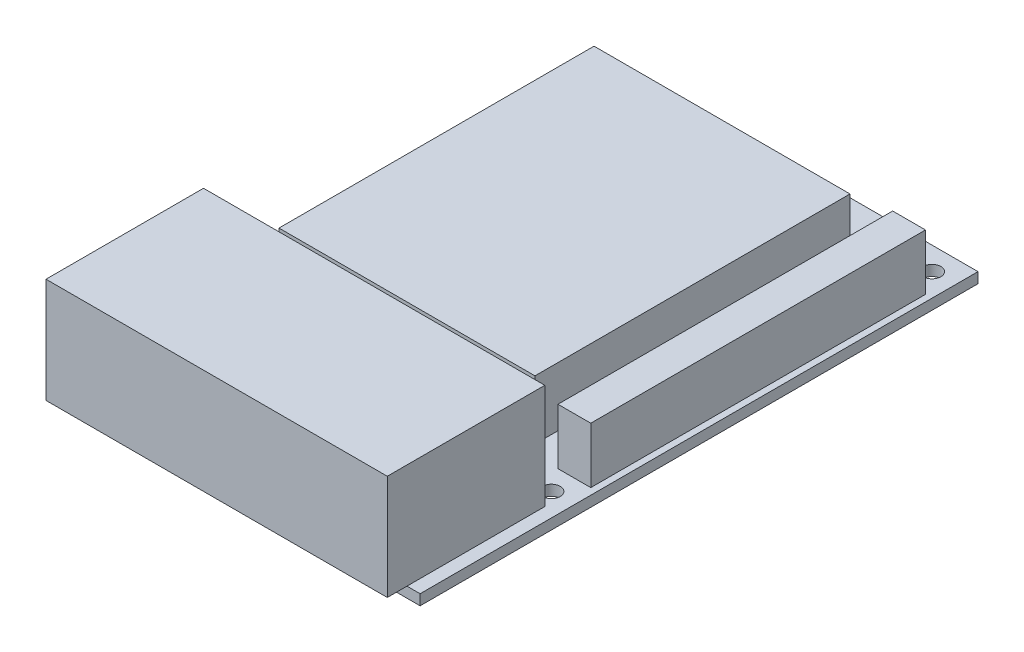
ISO-10303-21;
HEADER;
FILE_DESCRIPTION(('STEP AP214'),'2;1');
FILE_NAME('part.step','',(''),(''),'','','');
FILE_SCHEMA(('AUTOMOTIVE_DESIGN { 1 0 10303 214 1 1 1 1 }'));
ENDSEC;
DATA;
#1=APPLICATION_CONTEXT('core data for automotive mechanical design processes');
#2=APPLICATION_PROTOCOL_DEFINITION('international standard','automotive_design',2000,#1);
#3=PRODUCT_CONTEXT('',#1,'mechanical');
#4=PRODUCT('Part','Part','',(#3));
#5=PRODUCT_RELATED_PRODUCT_CATEGORY('part','',(#4));
#6=PRODUCT_DEFINITION_FORMATION('','',#4);
#7=PRODUCT_DEFINITION_CONTEXT('part definition',#1,'design');
#8=PRODUCT_DEFINITION('design','',#6,#7);
#9=PRODUCT_DEFINITION_SHAPE('','',#8);
#10=(LENGTH_UNIT() NAMED_UNIT(*) SI_UNIT(.MILLI.,.METRE.));
#11=(NAMED_UNIT(*) PLANE_ANGLE_UNIT() SI_UNIT($,.RADIAN.));
#12=(NAMED_UNIT(*) SI_UNIT($,.STERADIAN.) SOLID_ANGLE_UNIT());
#13=UNCERTAINTY_MEASURE_WITH_UNIT(LENGTH_MEASURE(1.E-05),#10,'distance_accuracy_value','');
#14=(GEOMETRIC_REPRESENTATION_CONTEXT(3) GLOBAL_UNCERTAINTY_ASSIGNED_CONTEXT((#13)) GLOBAL_UNIT_ASSIGNED_CONTEXT((#10,
#11,#12)) REPRESENTATION_CONTEXT('',''));
#15=CARTESIAN_POINT('',(0.,0.,0.));
#16=DIRECTION('',(0.,0.,1.));
#17=DIRECTION('',(1.,0.,0.));
#18=AXIS2_PLACEMENT_3D('',#15,#16,#17);
#19=CARTESIAN_POINT('',(0.,1.6,0.));
#20=DIRECTION('',(0.,1.,0.));
#21=DIRECTION('',(0.,0.,1.));
#22=AXIS2_PLACEMENT_3D('',#19,#20,#21);
#23=PLANE('',#22);
#24=DIRECTION('',(0.,0.,1.));
#25=VECTOR('',#24,1.);
#26=CARTESIAN_POINT('',(-26.,1.6,21.5));
#27=LINE('',#26,#25);
#28=CARTESIAN_POINT('',(-26.,1.6,21.5));
#29=VERTEX_POINT('',#28);
#30=CARTESIAN_POINT('',(-26.,1.6,42.5));
#31=VERTEX_POINT('',#30);
#32=EDGE_CURVE('E230',#29,#31,#27,.T.);
#33=ORIENTED_EDGE('',*,*,#32,.F.);
#34=DIRECTION('',(-1.,0.,0.));
#35=VECTOR('',#34,1.);
#36=CARTESIAN_POINT('',(-26.,1.6,21.5));
#37=LINE('',#36,#35);
#38=CARTESIAN_POINT('',(26.,1.6,21.5));
#39=VERTEX_POINT('',#38);
#40=EDGE_CURVE('E225',#39,#29,#37,.T.);
#41=ORIENTED_EDGE('',*,*,#40,.F.);
#42=DIRECTION('',(0.,0.,-1.));
#43=VECTOR('',#42,1.);
#44=CARTESIAN_POINT('',(26.,1.6,21.5));
#45=LINE('',#44,#43);
#46=CARTESIAN_POINT('',(26.,1.6,42.5));
#47=VERTEX_POINT('',#46);
#48=EDGE_CURVE('E11',#47,#39,#45,.T.);
#49=ORIENTED_EDGE('',*,*,#48,.F.);
#50=DIRECTION('',(1.,0.,0.));
#51=VECTOR('',#50,1.);
#52=CARTESIAN_POINT('',(-28.,1.6,42.5));
#53=LINE('',#52,#51);
#54=CARTESIAN_POINT('',(28.,1.6,42.5));
#55=VERTEX_POINT('',#54);
#56=EDGE_CURVE('E277',#47,#55,#53,.T.);
#57=ORIENTED_EDGE('',*,*,#56,.T.);
#58=DIRECTION('',(0.,0.,-1.));
#59=VECTOR('',#58,1.);
#60=CARTESIAN_POINT('',(28.,1.6,-42.5));
#61=LINE('',#60,#59);
#62=CARTESIAN_POINT('',(28.,1.6,-42.5));
#63=VERTEX_POINT('',#62);
#64=EDGE_CURVE('E283',#55,#63,#61,.T.);
#65=ORIENTED_EDGE('',*,*,#64,.T.);
#66=DIRECTION('',(-1.,0.,0.));
#67=VECTOR('',#66,1.);
#68=CARTESIAN_POINT('',(-28.,1.6,-42.5));
#69=LINE('',#68,#67);
#70=CARTESIAN_POINT('',(-28.,1.6,-42.5));
#71=VERTEX_POINT('',#70);
#72=EDGE_CURVE('E285',#63,#71,#69,.T.);
#73=ORIENTED_EDGE('',*,*,#72,.T.);
#74=DIRECTION('',(0.,0.,1.));
#75=VECTOR('',#74,1.);
#76=CARTESIAN_POINT('',(-28.,1.6,-42.5));
#77=LINE('',#76,#75);
#78=CARTESIAN_POINT('',(-28.,1.6,42.5));
#79=VERTEX_POINT('',#78);
#80=EDGE_CURVE('E271',#71,#79,#77,.T.);
#81=ORIENTED_EDGE('',*,*,#80,.T.);
#82=EDGE_CURVE('E279',#79,#31,#53,.T.);
#83=ORIENTED_EDGE('',*,*,#82,.T.);
#84=EDGE_LOOP('',(#33,#41,#49,#57,#65,#73,#81,#83));
#85=FACE_BOUND('',#84,.T.);
#86=CARTESIAN_POINT('',(24.5,1.6,-39.));
#87=DIRECTION('',(0.,1.,0.));
#88=DIRECTION('',(0.,0.,1.));
#89=AXIS2_PLACEMENT_3D('',#86,#87,#88);
#90=CIRCLE('',#89,1.35);
#91=CARTESIAN_POINT('',(24.5,1.6,-37.65));
#92=VERTEX_POINT('',#91);
#93=EDGE_CURVE('E256',#92,#92,#90,.T.);
#94=ORIENTED_EDGE('',*,*,#93,.F.);
#95=EDGE_LOOP('',(#94));
#96=FACE_BOUND('',#95,.T.);
#97=CARTESIAN_POINT('',(-24.5,1.6,19.));
#98=DIRECTION('',(0.,1.,0.));
#99=DIRECTION('',(0.,0.,1.));
#100=AXIS2_PLACEMENT_3D('',#97,#98,#99);
#101=CIRCLE('',#100,1.35);
#102=CARTESIAN_POINT('',(-24.5,1.6,20.35));
#103=VERTEX_POINT('',#102);
#104=EDGE_CURVE('E255',#103,#103,#101,.T.);
#105=ORIENTED_EDGE('',*,*,#104,.F.);
#106=EDGE_LOOP('',(#105));
#107=FACE_BOUND('',#106,.T.);
#108=CARTESIAN_POINT('',(24.5,1.6,19.));
#109=DIRECTION('',(0.,1.,0.));
#110=DIRECTION('',(0.,0.,1.));
#111=AXIS2_PLACEMENT_3D('',#108,#109,#110);
#112=CIRCLE('',#111,1.35);
#113=CARTESIAN_POINT('',(24.5,1.6,20.35));
#114=VERTEX_POINT('',#113);
#115=EDGE_CURVE('E247',#114,#114,#112,.T.);
#116=ORIENTED_EDGE('',*,*,#115,.F.);
#117=EDGE_LOOP('',(#116));
#118=FACE_BOUND('',#117,.T.);
#119=CARTESIAN_POINT('',(-24.5,1.6,-39.));
#120=DIRECTION('',(0.,1.,0.));
#121=DIRECTION('',(0.,0.,1.));
#122=AXIS2_PLACEMENT_3D('',#119,#120,#121);
#123=CIRCLE('',#122,1.35);
#124=CARTESIAN_POINT('',(-24.5,1.6,-37.65));
#125=VERTEX_POINT('',#124);
#126=EDGE_CURVE('E270',#125,#125,#123,.T.);
#127=ORIENTED_EDGE('',*,*,#126,.F.);
#128=EDGE_LOOP('',(#127));
#129=FACE_BOUND('',#128,.T.);
#130=DIRECTION('',(1.,0.,0.));
#131=VECTOR('',#130,1.);
#132=CARTESIAN_POINT('',(-22.,1.6,14.));
#133=LINE('',#132,#131);
#134=CARTESIAN_POINT('',(-22.,1.6,14.));
#135=VERTEX_POINT('',#134);
#136=CARTESIAN_POINT('',(17.,1.6,14.));
#137=VERTEX_POINT('',#136);
#138=EDGE_CURVE('E186',#135,#137,#133,.T.);
#139=ORIENTED_EDGE('',*,*,#138,.F.);
#140=DIRECTION('',(0.,0.,1.));
#141=VECTOR('',#140,1.);
#142=CARTESIAN_POINT('',(-22.,1.6,-34.));
#143=LINE('',#142,#141);
#144=CARTESIAN_POINT('',(-22.,1.6,-34.));
#145=VERTEX_POINT('',#144);
#146=EDGE_CURVE('E187',#145,#135,#143,.T.);
#147=ORIENTED_EDGE('',*,*,#146,.F.);
#148=DIRECTION('',(-1.,0.,0.));
#149=VECTOR('',#148,1.);
#150=CARTESIAN_POINT('',(-22.,1.6,-34.));
#151=LINE('',#150,#149);
#152=CARTESIAN_POINT('',(17.,1.6,-34.));
#153=VERTEX_POINT('',#152);
#154=EDGE_CURVE('E197',#153,#145,#151,.T.);
#155=ORIENTED_EDGE('',*,*,#154,.F.);
#156=DIRECTION('',(0.,0.,-1.));
#157=VECTOR('',#156,1.);
#158=CARTESIAN_POINT('',(17.,1.6,-34.));
#159=LINE('',#158,#157);
#160=EDGE_CURVE('E207',#137,#153,#159,.T.);
#161=ORIENTED_EDGE('',*,*,#160,.F.);
#162=EDGE_LOOP('',(#139,#147,#155,#161));
#163=FACE_BOUND('',#162,.T.);
#164=DIRECTION('',(1.,0.,0.));
#165=VECTOR('',#164,1.);
#166=CARTESIAN_POINT('',(22.,1.6,15.5));
#167=LINE('',#166,#165);
#168=CARTESIAN_POINT('',(22.,1.6,15.5));
#169=VERTEX_POINT('',#168);
#170=CARTESIAN_POINT('',(27.,1.6,15.5));
#171=VERTEX_POINT('',#170);
#172=EDGE_CURVE('E523',#169,#171,#167,.T.);
#173=ORIENTED_EDGE('',*,*,#172,.F.);
#174=DIRECTION('',(0.,0.,1.));
#175=VECTOR('',#174,1.);
#176=CARTESIAN_POINT('',(22.,1.6,-35.5));
#177=LINE('',#176,#175);
#178=CARTESIAN_POINT('',(22.,1.6,-35.5));
#179=VERTEX_POINT('',#178);
#180=EDGE_CURVE('E183',#179,#169,#177,.T.);
#181=ORIENTED_EDGE('',*,*,#180,.F.);
#182=DIRECTION('',(-1.,0.,0.));
#183=VECTOR('',#182,1.);
#184=CARTESIAN_POINT('',(22.,1.6,-35.5));
#185=LINE('',#184,#183);
#186=CARTESIAN_POINT('',(27.,1.6,-35.5));
#187=VERTEX_POINT('',#186);
#188=EDGE_CURVE('E179',#187,#179,#185,.T.);
#189=ORIENTED_EDGE('',*,*,#188,.F.);
#190=DIRECTION('',(0.,0.,-1.));
#191=VECTOR('',#190,1.);
#192=CARTESIAN_POINT('',(27.,1.6,-35.5));
#193=LINE('',#192,#191);
#194=EDGE_CURVE('E519',#171,#187,#193,.T.);
#195=ORIENTED_EDGE('',*,*,#194,.F.);
#196=EDGE_LOOP('',(#173,#181,#189,#195));
#197=FACE_BOUND('',#196,.T.);
#198=ADVANCED_FACE('F39',(#85,#96,#107,#118,#129,#163,#197),#23,.T.);
#199=CARTESIAN_POINT('',(-28.,1.6,-42.5));
#200=DIRECTION('',(1.,0.,0.));
#201=DIRECTION('',(0.,0.,-1.));
#202=AXIS2_PLACEMENT_3D('',#199,#200,#201);
#203=PLANE('',#202);
#204=DIRECTION('',(0.,0.,1.));
#205=VECTOR('',#204,1.);
#206=CARTESIAN_POINT('',(-28.,0.,-42.5));
#207=LINE('',#206,#205);
#208=CARTESIAN_POINT('',(-28.,0.,-42.5));
#209=VERTEX_POINT('',#208);
#210=CARTESIAN_POINT('',(-28.,0.,42.5));
#211=VERTEX_POINT('',#210);
#212=EDGE_CURVE('E269',#209,#211,#207,.T.);
#213=ORIENTED_EDGE('',*,*,#212,.T.);
#214=DIRECTION('',(0.,-1.,0.));
#215=VECTOR('',#214,1.);
#216=CARTESIAN_POINT('',(-28.,1.6,42.5));
#217=LINE('',#216,#215);
#218=EDGE_CURVE('E43',#79,#211,#217,.T.);
#219=ORIENTED_EDGE('',*,*,#218,.F.);
#220=ORIENTED_EDGE('',*,*,#80,.F.);
#221=DIRECTION('',(0.,-1.,0.));
#222=VECTOR('',#221,1.);
#223=CARTESIAN_POINT('',(-28.,1.6,-42.5));
#224=LINE('',#223,#222);
#225=EDGE_CURVE('E286',#71,#209,#224,.T.);
#226=ORIENTED_EDGE('',*,*,#225,.T.);
#227=EDGE_LOOP('',(#213,#219,#220,#226));
#228=FACE_BOUND('',#227,.T.);
#229=ADVANCED_FACE('F41',(#228),#203,.F.);
#230=CARTESIAN_POINT('',(-28.,1.6,42.5));
#231=DIRECTION('',(0.,0.,-1.));
#232=DIRECTION('',(-1.,0.,0.));
#233=AXIS2_PLACEMENT_3D('',#230,#231,#232);
#234=PLANE('',#233);
#235=DIRECTION('',(1.,0.,0.));
#236=VECTOR('',#235,1.);
#237=CARTESIAN_POINT('',(-28.,0.,42.5));
#238=LINE('',#237,#236);
#239=CARTESIAN_POINT('',(28.,0.,42.5));
#240=VERTEX_POINT('',#239);
#241=EDGE_CURVE('E287',#211,#240,#238,.T.);
#242=ORIENTED_EDGE('',*,*,#241,.T.);
#243=DIRECTION('',(0.,-1.,0.));
#244=VECTOR('',#243,1.);
#245=CARTESIAN_POINT('',(28.,1.6,42.5));
#246=LINE('',#245,#244);
#247=EDGE_CURVE('E296',#55,#240,#246,.T.);
#248=ORIENTED_EDGE('',*,*,#247,.F.);
#249=ORIENTED_EDGE('',*,*,#56,.F.);
#250=EDGE_CURVE('E284',#31,#47,#53,.T.);
#251=ORIENTED_EDGE('',*,*,#250,.F.);
#252=ORIENTED_EDGE('',*,*,#82,.F.);
#253=ORIENTED_EDGE('',*,*,#218,.T.);
#254=EDGE_LOOP('',(#242,#248,#249,#251,#252,#253));
#255=FACE_BOUND('',#254,.T.);
#256=ADVANCED_FACE('F310',(#255),#234,.F.);
#257=CARTESIAN_POINT('',(28.,1.6,-42.5));
#258=DIRECTION('',(-1.,0.,0.));
#259=DIRECTION('',(0.,0.,1.));
#260=AXIS2_PLACEMENT_3D('',#257,#258,#259);
#261=PLANE('',#260);
#262=DIRECTION('',(0.,0.,-1.));
#263=VECTOR('',#262,1.);
#264=CARTESIAN_POINT('',(28.,0.,-42.5));
#265=LINE('',#264,#263);
#266=CARTESIAN_POINT('',(28.,0.,-42.5));
#267=VERTEX_POINT('',#266);
#268=EDGE_CURVE('E293',#240,#267,#265,.T.);
#269=ORIENTED_EDGE('',*,*,#268,.T.);
#270=DIRECTION('',(0.,-1.,0.));
#271=VECTOR('',#270,1.);
#272=CARTESIAN_POINT('',(28.,1.6,-42.5));
#273=LINE('',#272,#271);
#274=EDGE_CURVE('E298',#63,#267,#273,.T.);
#275=ORIENTED_EDGE('',*,*,#274,.F.);
#276=ORIENTED_EDGE('',*,*,#64,.F.);
#277=ORIENTED_EDGE('',*,*,#247,.T.);
#278=EDGE_LOOP('',(#269,#275,#276,#277));
#279=FACE_BOUND('',#278,.T.);
#280=ADVANCED_FACE('F317',(#279),#261,.F.);
#281=CARTESIAN_POINT('',(-28.,1.6,-42.5));
#282=DIRECTION('',(0.,0.,1.));
#283=DIRECTION('',(1.,0.,0.));
#284=AXIS2_PLACEMENT_3D('',#281,#282,#283);
#285=PLANE('',#284);
#286=DIRECTION('',(-1.,0.,0.));
#287=VECTOR('',#286,1.);
#288=CARTESIAN_POINT('',(-28.,0.,-42.5));
#289=LINE('',#288,#287);
#290=EDGE_CURVE('E280',#267,#209,#289,.T.);
#291=ORIENTED_EDGE('',*,*,#290,.T.);
#292=ORIENTED_EDGE('',*,*,#225,.F.);
#293=ORIENTED_EDGE('',*,*,#72,.F.);
#294=ORIENTED_EDGE('',*,*,#274,.T.);
#295=EDGE_LOOP('',(#291,#292,#293,#294));
#296=FACE_BOUND('',#295,.T.);
#297=ADVANCED_FACE('F316',(#296),#285,.F.);
#298=CARTESIAN_POINT('',(0.,0.,0.));
#299=DIRECTION('',(0.,1.,0.));
#300=DIRECTION('',(0.,0.,1.));
#301=AXIS2_PLACEMENT_3D('',#298,#299,#300);
#302=PLANE('',#301);
#303=CARTESIAN_POINT('',(24.5,0.,-39.));
#304=DIRECTION('',(0.,1.,0.));
#305=DIRECTION('',(0.,0.,1.));
#306=AXIS2_PLACEMENT_3D('',#303,#304,#305);
#307=CIRCLE('',#306,1.35);
#308=CARTESIAN_POINT('',(24.5,0.,-37.65));
#309=VERTEX_POINT('',#308);
#310=EDGE_CURVE('E253',#309,#309,#307,.T.);
#311=ORIENTED_EDGE('',*,*,#310,.T.);
#312=EDGE_LOOP('',(#311));
#313=FACE_BOUND('',#312,.T.);
#314=CARTESIAN_POINT('',(-24.5,0.,19.));
#315=DIRECTION('',(0.,1.,0.));
#316=DIRECTION('',(0.,0.,1.));
#317=AXIS2_PLACEMENT_3D('',#314,#315,#316);
#318=CIRCLE('',#317,1.35);
#319=CARTESIAN_POINT('',(-24.5,0.,20.35));
#320=VERTEX_POINT('',#319);
#321=EDGE_CURVE('E264',#320,#320,#318,.T.);
#322=ORIENTED_EDGE('',*,*,#321,.T.);
#323=EDGE_LOOP('',(#322));
#324=FACE_BOUND('',#323,.T.);
#325=CARTESIAN_POINT('',(24.5,0.,19.));
#326=DIRECTION('',(0.,1.,0.));
#327=DIRECTION('',(0.,0.,1.));
#328=AXIS2_PLACEMENT_3D('',#325,#326,#327);
#329=CIRCLE('',#328,1.35);
#330=CARTESIAN_POINT('',(24.5,0.,20.35));
#331=VERTEX_POINT('',#330);
#332=EDGE_CURVE('E248',#331,#331,#329,.T.);
#333=ORIENTED_EDGE('',*,*,#332,.T.);
#334=EDGE_LOOP('',(#333));
#335=FACE_BOUND('',#334,.T.);
#336=CARTESIAN_POINT('',(-24.5,0.,-39.));
#337=DIRECTION('',(0.,1.,0.));
#338=DIRECTION('',(0.,0.,1.));
#339=AXIS2_PLACEMENT_3D('',#336,#337,#338);
#340=CIRCLE('',#339,1.35);
#341=CARTESIAN_POINT('',(-24.5,0.,-37.65));
#342=VERTEX_POINT('',#341);
#343=EDGE_CURVE('E259',#342,#342,#340,.T.);
#344=ORIENTED_EDGE('',*,*,#343,.T.);
#345=EDGE_LOOP('',(#344));
#346=FACE_BOUND('',#345,.T.);
#347=ORIENTED_EDGE('',*,*,#212,.F.);
#348=ORIENTED_EDGE('',*,*,#290,.F.);
#349=ORIENTED_EDGE('',*,*,#268,.F.);
#350=ORIENTED_EDGE('',*,*,#241,.F.);
#351=EDGE_LOOP('',(#347,#348,#349,#350));
#352=FACE_BOUND('',#351,.T.);
#353=ADVANCED_FACE('F313',(#313,#324,#335,#346,#352),#302,.F.);
#354=CARTESIAN_POINT('',(-24.5,1.6,-39.));
#355=DIRECTION('',(0.,-1.,0.));
#356=DIRECTION('',(0.,0.,-1.));
#357=AXIS2_PLACEMENT_3D('',#354,#355,#356);
#358=CYLINDRICAL_SURFACE('',#357,1.35);
#359=ORIENTED_EDGE('',*,*,#126,.T.);
#360=EDGE_LOOP('',(#359));
#361=FACE_BOUND('',#360,.T.);
#362=ORIENTED_EDGE('',*,*,#343,.F.);
#363=EDGE_LOOP('',(#362));
#364=FACE_BOUND('',#363,.T.);
#365=ADVANCED_FACE('F370',(#361,#364),#358,.F.);
#366=CARTESIAN_POINT('',(24.5,1.6,19.));
#367=DIRECTION('',(0.,-1.,0.));
#368=DIRECTION('',(0.,0.,-1.));
#369=AXIS2_PLACEMENT_3D('',#366,#367,#368);
#370=CYLINDRICAL_SURFACE('',#369,1.35);
#371=ORIENTED_EDGE('',*,*,#115,.T.);
#372=EDGE_LOOP('',(#371));
#373=FACE_BOUND('',#372,.T.);
#374=ORIENTED_EDGE('',*,*,#332,.F.);
#375=EDGE_LOOP('',(#374));
#376=FACE_BOUND('',#375,.T.);
#377=ADVANCED_FACE('F552',(#373,#376),#370,.F.);
#378=CARTESIAN_POINT('',(-24.5,1.6,19.));
#379=DIRECTION('',(0.,-1.,0.));
#380=DIRECTION('',(0.,0.,-1.));
#381=AXIS2_PLACEMENT_3D('',#378,#379,#380);
#382=CYLINDRICAL_SURFACE('',#381,1.35);
#383=ORIENTED_EDGE('',*,*,#104,.T.);
#384=EDGE_LOOP('',(#383));
#385=FACE_BOUND('',#384,.T.);
#386=ORIENTED_EDGE('',*,*,#321,.F.);
#387=EDGE_LOOP('',(#386));
#388=FACE_BOUND('',#387,.T.);
#389=ADVANCED_FACE('F545',(#385,#388),#382,.F.);
#390=CARTESIAN_POINT('',(24.5,1.6,-39.));
#391=DIRECTION('',(0.,-1.,0.));
#392=DIRECTION('',(0.,0.,-1.));
#393=AXIS2_PLACEMENT_3D('',#390,#391,#392);
#394=CYLINDRICAL_SURFACE('',#393,1.35);
#395=ORIENTED_EDGE('',*,*,#93,.T.);
#396=EDGE_LOOP('',(#395));
#397=FACE_BOUND('',#396,.T.);
#398=ORIENTED_EDGE('',*,*,#310,.F.);
#399=EDGE_LOOP('',(#398));
#400=FACE_BOUND('',#399,.T.);
#401=ADVANCED_FACE('F383',(#397,#400),#394,.F.);
#402=CARTESIAN_POINT('',(0.,1.6,0.));
#403=DIRECTION('',(0.,1.,0.));
#404=DIRECTION('',(0.,0.,1.));
#405=AXIS2_PLACEMENT_3D('',#402,#403,#404);
#406=PLANE('',#405);
#407=CARTESIAN_POINT('',(-26.,1.6,45.5));
#408=VERTEX_POINT('',#407);
#409=EDGE_CURVE('E219',#31,#408,#27,.T.);
#410=ORIENTED_EDGE('',*,*,#409,.F.);
#411=ORIENTED_EDGE('',*,*,#250,.T.);
#412=CARTESIAN_POINT('',(26.,1.6,45.5));
#413=VERTEX_POINT('',#412);
#414=EDGE_CURVE('E47',#413,#47,#45,.T.);
#415=ORIENTED_EDGE('',*,*,#414,.F.);
#416=DIRECTION('',(1.,0.,0.));
#417=VECTOR('',#416,1.);
#418=CARTESIAN_POINT('',(-26.,1.6,45.5));
#419=LINE('',#418,#417);
#420=EDGE_CURVE('E235',#408,#413,#419,.T.);
#421=ORIENTED_EDGE('',*,*,#420,.F.);
#422=EDGE_LOOP('',(#410,#411,#415,#421));
#423=FACE_BOUND('',#422,.T.);
#424=ADVANCED_FACE('F329',(#423),#406,.F.);
#425=CARTESIAN_POINT('',(-26.,17.6,21.5));
#426=DIRECTION('',(1.,0.,0.));
#427=DIRECTION('',(0.,0.,-1.));
#428=AXIS2_PLACEMENT_3D('',#425,#426,#427);
#429=PLANE('',#428);
#430=ORIENTED_EDGE('',*,*,#32,.T.);
#431=ORIENTED_EDGE('',*,*,#409,.T.);
#432=DIRECTION('',(0.,-1.,0.));
#433=VECTOR('',#432,1.);
#434=CARTESIAN_POINT('',(-26.,17.6,45.5));
#435=LINE('',#434,#433);
#436=CARTESIAN_POINT('',(-26.,17.6,45.5));
#437=VERTEX_POINT('',#436);
#438=EDGE_CURVE('E244',#437,#408,#435,.T.);
#439=ORIENTED_EDGE('',*,*,#438,.F.);
#440=DIRECTION('',(0.,0.,1.));
#441=VECTOR('',#440,1.);
#442=CARTESIAN_POINT('',(-26.,17.6,21.5));
#443=LINE('',#442,#441);
#444=CARTESIAN_POINT('',(-26.,17.6,21.5));
#445=VERTEX_POINT('',#444);
#446=EDGE_CURVE('E217',#445,#437,#443,.T.);
#447=ORIENTED_EDGE('',*,*,#446,.F.);
#448=DIRECTION('',(0.,-1.,0.));
#449=VECTOR('',#448,1.);
#450=CARTESIAN_POINT('',(-26.,17.6,21.5));
#451=LINE('',#450,#449);
#452=EDGE_CURVE('E226',#445,#29,#451,.T.);
#453=ORIENTED_EDGE('',*,*,#452,.T.);
#454=EDGE_LOOP('',(#430,#431,#439,#447,#453));
#455=FACE_BOUND('',#454,.T.);
#456=ADVANCED_FACE('F339',(#455),#429,.F.);
#457=CARTESIAN_POINT('',(-26.,17.6,45.5));
#458=DIRECTION('',(0.,0.,-1.));
#459=DIRECTION('',(-1.,0.,0.));
#460=AXIS2_PLACEMENT_3D('',#457,#458,#459);
#461=PLANE('',#460);
#462=ORIENTED_EDGE('',*,*,#420,.T.);
#463=DIRECTION('',(0.,-1.,0.));
#464=VECTOR('',#463,1.);
#465=CARTESIAN_POINT('',(26.,17.6,45.5));
#466=LINE('',#465,#464);
#467=CARTESIAN_POINT('',(26.,17.6,45.5));
#468=VERTEX_POINT('',#467);
#469=EDGE_CURVE('E245',#468,#413,#466,.T.);
#470=ORIENTED_EDGE('',*,*,#469,.F.);
#471=DIRECTION('',(1.,0.,0.));
#472=VECTOR('',#471,1.);
#473=CARTESIAN_POINT('',(-26.,17.6,45.5));
#474=LINE('',#473,#472);
#475=EDGE_CURVE('E221',#437,#468,#474,.T.);
#476=ORIENTED_EDGE('',*,*,#475,.F.);
#477=ORIENTED_EDGE('',*,*,#438,.T.);
#478=EDGE_LOOP('',(#462,#470,#476,#477));
#479=FACE_BOUND('',#478,.T.);
#480=ADVANCED_FACE('F334',(#479),#461,.F.);
#481=CARTESIAN_POINT('',(26.,17.6,21.5));
#482=DIRECTION('',(-1.,0.,0.));
#483=DIRECTION('',(0.,0.,1.));
#484=AXIS2_PLACEMENT_3D('',#481,#482,#483);
#485=PLANE('',#484);
#486=ORIENTED_EDGE('',*,*,#414,.T.);
#487=ORIENTED_EDGE('',*,*,#48,.T.);
#488=DIRECTION('',(0.,-1.,0.));
#489=VECTOR('',#488,1.);
#490=CARTESIAN_POINT('',(26.,17.6,21.5));
#491=LINE('',#490,#489);
#492=CARTESIAN_POINT('',(26.,17.6,21.5));
#493=VERTEX_POINT('',#492);
#494=EDGE_CURVE('E237',#493,#39,#491,.T.);
#495=ORIENTED_EDGE('',*,*,#494,.F.);
#496=DIRECTION('',(0.,0.,-1.));
#497=VECTOR('',#496,1.);
#498=CARTESIAN_POINT('',(26.,17.6,21.5));
#499=LINE('',#498,#497);
#500=EDGE_CURVE('E222',#468,#493,#499,.T.);
#501=ORIENTED_EDGE('',*,*,#500,.F.);
#502=ORIENTED_EDGE('',*,*,#469,.T.);
#503=EDGE_LOOP('',(#486,#487,#495,#501,#502));
#504=FACE_BOUND('',#503,.T.);
#505=ADVANCED_FACE('F326',(#504),#485,.F.);
#506=CARTESIAN_POINT('',(-26.,17.6,21.5));
#507=DIRECTION('',(0.,0.,1.));
#508=DIRECTION('',(1.,0.,0.));
#509=AXIS2_PLACEMENT_3D('',#506,#507,#508);
#510=PLANE('',#509);
#511=ORIENTED_EDGE('',*,*,#40,.T.);
#512=ORIENTED_EDGE('',*,*,#452,.F.);
#513=DIRECTION('',(-1.,0.,0.));
#514=VECTOR('',#513,1.);
#515=CARTESIAN_POINT('',(-26.,17.6,21.5));
#516=LINE('',#515,#514);
#517=EDGE_CURVE('E228',#493,#445,#516,.T.);
#518=ORIENTED_EDGE('',*,*,#517,.F.);
#519=ORIENTED_EDGE('',*,*,#494,.T.);
#520=EDGE_LOOP('',(#511,#512,#518,#519));
#521=FACE_BOUND('',#520,.T.);
#522=ADVANCED_FACE('F345',(#521),#510,.F.);
#523=CARTESIAN_POINT('',(0.,17.6,0.));
#524=DIRECTION('',(0.,1.,0.));
#525=DIRECTION('',(0.,0.,1.));
#526=AXIS2_PLACEMENT_3D('',#523,#524,#525);
#527=PLANE('',#526);
#528=ORIENTED_EDGE('',*,*,#446,.T.);
#529=ORIENTED_EDGE('',*,*,#475,.T.);
#530=ORIENTED_EDGE('',*,*,#500,.T.);
#531=ORIENTED_EDGE('',*,*,#517,.T.);
#532=EDGE_LOOP('',(#528,#529,#530,#531));
#533=FACE_BOUND('',#532,.T.);
#534=ADVANCED_FACE('F343',(#533),#527,.T.);
#535=CARTESIAN_POINT('',(-22.,10.6,-34.));
#536=DIRECTION('',(1.,0.,0.));
#537=DIRECTION('',(0.,0.,-1.));
#538=AXIS2_PLACEMENT_3D('',#535,#536,#537);
#539=PLANE('',#538);
#540=ORIENTED_EDGE('',*,*,#146,.T.);
#541=DIRECTION('',(0.,-1.,0.));
#542=VECTOR('',#541,1.);
#543=CARTESIAN_POINT('',(-22.,10.6,14.));
#544=LINE('',#543,#542);
#545=CARTESIAN_POINT('',(-22.,10.6,14.));
#546=VERTEX_POINT('',#545);
#547=EDGE_CURVE('E213',#546,#135,#544,.T.);
#548=ORIENTED_EDGE('',*,*,#547,.F.);
#549=DIRECTION('',(0.,0.,1.));
#550=VECTOR('',#549,1.);
#551=CARTESIAN_POINT('',(-22.,10.6,-34.));
#552=LINE('',#551,#550);
#553=CARTESIAN_POINT('',(-22.,10.6,-34.));
#554=VERTEX_POINT('',#553);
#555=EDGE_CURVE('E191',#554,#546,#552,.T.);
#556=ORIENTED_EDGE('',*,*,#555,.F.);
#557=DIRECTION('',(0.,-1.,0.));
#558=VECTOR('',#557,1.);
#559=CARTESIAN_POINT('',(-22.,10.6,-34.));
#560=LINE('',#559,#558);
#561=EDGE_CURVE('E203',#554,#145,#560,.T.);
#562=ORIENTED_EDGE('',*,*,#561,.T.);
#563=EDGE_LOOP('',(#540,#548,#556,#562));
#564=FACE_BOUND('',#563,.T.);
#565=ADVANCED_FACE('F349',(#564),#539,.F.);
#566=CARTESIAN_POINT('',(-22.,10.6,14.));
#567=DIRECTION('',(0.,0.,-1.));
#568=DIRECTION('',(-1.,0.,0.));
#569=AXIS2_PLACEMENT_3D('',#566,#567,#568);
#570=PLANE('',#569);
#571=ORIENTED_EDGE('',*,*,#138,.T.);
#572=DIRECTION('',(0.,-1.,0.));
#573=VECTOR('',#572,1.);
#574=CARTESIAN_POINT('',(17.,10.6,14.));
#575=LINE('',#574,#573);
#576=CARTESIAN_POINT('',(17.,10.6,14.));
#577=VERTEX_POINT('',#576);
#578=EDGE_CURVE('E215',#577,#137,#575,.T.);
#579=ORIENTED_EDGE('',*,*,#578,.F.);
#580=DIRECTION('',(1.,0.,0.));
#581=VECTOR('',#580,1.);
#582=CARTESIAN_POINT('',(-22.,10.6,14.));
#583=LINE('',#582,#581);
#584=EDGE_CURVE('E199',#546,#577,#583,.T.);
#585=ORIENTED_EDGE('',*,*,#584,.F.);
#586=ORIENTED_EDGE('',*,*,#547,.T.);
#587=EDGE_LOOP('',(#571,#579,#585,#586));
#588=FACE_BOUND('',#587,.T.);
#589=ADVANCED_FACE('F353',(#588),#570,.F.);
#590=CARTESIAN_POINT('',(17.,10.6,-34.));
#591=DIRECTION('',(-1.,0.,0.));
#592=DIRECTION('',(0.,0.,1.));
#593=AXIS2_PLACEMENT_3D('',#590,#591,#592);
#594=PLANE('',#593);
#595=ORIENTED_EDGE('',*,*,#160,.T.);
#596=DIRECTION('',(0.,-1.,0.));
#597=VECTOR('',#596,1.);
#598=CARTESIAN_POINT('',(17.,10.6,-34.));
#599=LINE('',#598,#597);
#600=CARTESIAN_POINT('',(17.,10.6,-34.));
#601=VERTEX_POINT('',#600);
#602=EDGE_CURVE('E61',#601,#153,#599,.T.);
#603=ORIENTED_EDGE('',*,*,#602,.F.);
#604=DIRECTION('',(0.,0.,-1.));
#605=VECTOR('',#604,1.);
#606=CARTESIAN_POINT('',(17.,10.6,-34.));
#607=LINE('',#606,#605);
#608=EDGE_CURVE('E196',#577,#601,#607,.T.);
#609=ORIENTED_EDGE('',*,*,#608,.F.);
#610=ORIENTED_EDGE('',*,*,#578,.T.);
#611=EDGE_LOOP('',(#595,#603,#609,#610));
#612=FACE_BOUND('',#611,.T.);
#613=ADVANCED_FACE('F440',(#612),#594,.F.);
#614=CARTESIAN_POINT('',(-22.,10.6,-34.));
#615=DIRECTION('',(0.,0.,1.));
#616=DIRECTION('',(1.,0.,0.));
#617=AXIS2_PLACEMENT_3D('',#614,#615,#616);
#618=PLANE('',#617);
#619=ORIENTED_EDGE('',*,*,#154,.T.);
#620=ORIENTED_EDGE('',*,*,#561,.F.);
#621=DIRECTION('',(-1.,0.,0.));
#622=VECTOR('',#621,1.);
#623=CARTESIAN_POINT('',(-22.,10.6,-34.));
#624=LINE('',#623,#622);
#625=EDGE_CURVE('E205',#601,#554,#624,.T.);
#626=ORIENTED_EDGE('',*,*,#625,.F.);
#627=ORIENTED_EDGE('',*,*,#602,.T.);
#628=EDGE_LOOP('',(#619,#620,#626,#627));
#629=FACE_BOUND('',#628,.T.);
#630=ADVANCED_FACE('F450',(#629),#618,.F.);
#631=CARTESIAN_POINT('',(0.,10.6,0.));
#632=DIRECTION('',(0.,1.,0.));
#633=DIRECTION('',(0.,0.,1.));
#634=AXIS2_PLACEMENT_3D('',#631,#632,#633);
#635=PLANE('',#634);
#636=ORIENTED_EDGE('',*,*,#555,.T.);
#637=ORIENTED_EDGE('',*,*,#584,.T.);
#638=ORIENTED_EDGE('',*,*,#608,.T.);
#639=ORIENTED_EDGE('',*,*,#625,.T.);
#640=EDGE_LOOP('',(#636,#637,#638,#639));
#641=FACE_BOUND('',#640,.T.);
#642=ADVANCED_FACE('F459',(#641),#635,.T.);
#643=CARTESIAN_POINT('',(22.,10.1,-35.5));
#644=DIRECTION('',(1.,0.,0.));
#645=DIRECTION('',(0.,0.,-1.));
#646=AXIS2_PLACEMENT_3D('',#643,#644,#645);
#647=PLANE('',#646);
#648=ORIENTED_EDGE('',*,*,#180,.T.);
#649=DIRECTION('',(0.,-1.,0.));
#650=VECTOR('',#649,1.);
#651=CARTESIAN_POINT('',(22.,10.1,15.5));
#652=LINE('',#651,#650);
#653=CARTESIAN_POINT('',(22.,10.1,15.5));
#654=VERTEX_POINT('',#653);
#655=EDGE_CURVE('E164',#654,#169,#652,.T.);
#656=ORIENTED_EDGE('',*,*,#655,.F.);
#657=DIRECTION('',(0.,0.,1.));
#658=VECTOR('',#657,1.);
#659=CARTESIAN_POINT('',(22.,10.1,-35.5));
#660=LINE('',#659,#658);
#661=CARTESIAN_POINT('',(22.,10.1,-35.5));
#662=VERTEX_POINT('',#661);
#663=EDGE_CURVE('E175',#662,#654,#660,.T.);
#664=ORIENTED_EDGE('',*,*,#663,.F.);
#665=DIRECTION('',(0.,-1.,0.));
#666=VECTOR('',#665,1.);
#667=CARTESIAN_POINT('',(22.,10.1,-35.5));
#668=LINE('',#667,#666);
#669=EDGE_CURVE('E513',#662,#179,#668,.T.);
#670=ORIENTED_EDGE('',*,*,#669,.T.);
#671=EDGE_LOOP('',(#648,#656,#664,#670));
#672=FACE_BOUND('',#671,.T.);
#673=ADVANCED_FACE('F185',(#672),#647,.F.);
#674=CARTESIAN_POINT('',(22.,10.1,15.5));
#675=DIRECTION('',(0.,0.,-1.));
#676=DIRECTION('',(-1.,0.,0.));
#677=AXIS2_PLACEMENT_3D('',#674,#675,#676);
#678=PLANE('',#677);
#679=ORIENTED_EDGE('',*,*,#172,.T.);
#680=DIRECTION('',(0.,-1.,0.));
#681=VECTOR('',#680,1.);
#682=CARTESIAN_POINT('',(27.,10.1,15.5));
#683=LINE('',#682,#681);
#684=CARTESIAN_POINT('',(27.,10.1,15.5));
#685=VERTEX_POINT('',#684);
#686=EDGE_CURVE('E166',#685,#171,#683,.T.);
#687=ORIENTED_EDGE('',*,*,#686,.F.);
#688=DIRECTION('',(1.,0.,0.));
#689=VECTOR('',#688,1.);
#690=CARTESIAN_POINT('',(22.,10.1,15.5));
#691=LINE('',#690,#689);
#692=EDGE_CURVE('E163',#654,#685,#691,.T.);
#693=ORIENTED_EDGE('',*,*,#692,.F.);
#694=ORIENTED_EDGE('',*,*,#655,.T.);
#695=EDGE_LOOP('',(#679,#687,#693,#694));
#696=FACE_BOUND('',#695,.T.);
#697=ADVANCED_FACE('F161',(#696),#678,.F.);
#698=CARTESIAN_POINT('',(27.,10.1,-35.5));
#699=DIRECTION('',(-1.,0.,0.));
#700=DIRECTION('',(0.,0.,1.));
#701=AXIS2_PLACEMENT_3D('',#698,#699,#700);
#702=PLANE('',#701);
#703=ORIENTED_EDGE('',*,*,#194,.T.);
#704=DIRECTION('',(0.,-1.,0.));
#705=VECTOR('',#704,1.);
#706=CARTESIAN_POINT('',(27.,10.1,-35.5));
#707=LINE('',#706,#705);
#708=CARTESIAN_POINT('',(27.,10.1,-35.5));
#709=VERTEX_POINT('',#708);
#710=EDGE_CURVE('E57',#709,#187,#707,.T.);
#711=ORIENTED_EDGE('',*,*,#710,.F.);
#712=DIRECTION('',(0.,0.,-1.));
#713=VECTOR('',#712,1.);
#714=CARTESIAN_POINT('',(27.,10.1,-35.5));
#715=LINE('',#714,#713);
#716=EDGE_CURVE('E171',#685,#709,#715,.T.);
#717=ORIENTED_EDGE('',*,*,#716,.F.);
#718=ORIENTED_EDGE('',*,*,#686,.T.);
#719=EDGE_LOOP('',(#703,#711,#717,#718));
#720=FACE_BOUND('',#719,.T.);
#721=ADVANCED_FACE('F484',(#720),#702,.F.);
#722=CARTESIAN_POINT('',(22.,10.1,-35.5));
#723=DIRECTION('',(0.,0.,1.));
#724=DIRECTION('',(1.,0.,0.));
#725=AXIS2_PLACEMENT_3D('',#722,#723,#724);
#726=PLANE('',#725);
#727=ORIENTED_EDGE('',*,*,#188,.T.);
#728=ORIENTED_EDGE('',*,*,#669,.F.);
#729=DIRECTION('',(-1.,0.,0.));
#730=VECTOR('',#729,1.);
#731=CARTESIAN_POINT('',(22.,10.1,-35.5));
#732=LINE('',#731,#730);
#733=EDGE_CURVE('E176',#709,#662,#732,.T.);
#734=ORIENTED_EDGE('',*,*,#733,.F.);
#735=ORIENTED_EDGE('',*,*,#710,.T.);
#736=EDGE_LOOP('',(#727,#728,#734,#735));
#737=FACE_BOUND('',#736,.T.);
#738=ADVANCED_FACE('F494',(#737),#726,.F.);
#739=CARTESIAN_POINT('',(0.,10.1,0.));
#740=DIRECTION('',(0.,1.,0.));
#741=DIRECTION('',(0.,0.,1.));
#742=AXIS2_PLACEMENT_3D('',#739,#740,#741);
#743=PLANE('',#742);
#744=ORIENTED_EDGE('',*,*,#663,.T.);
#745=ORIENTED_EDGE('',*,*,#692,.T.);
#746=ORIENTED_EDGE('',*,*,#716,.T.);
#747=ORIENTED_EDGE('',*,*,#733,.T.);
#748=EDGE_LOOP('',(#744,#745,#746,#747));
#749=FACE_BOUND('',#748,.T.);
#750=ADVANCED_FACE('F174',(#749),#743,.T.);
#751=CLOSED_SHELL('',(#198,#229,#256,#280,#297,#353,#365,#377,#389,#401,#424,#456,#480,#505,
#522,#534,#565,#589,#613,#630,#642,#673,#697,#721,#738,#750));
#752=MANIFOLD_SOLID_BREP('B2',#751);
#753=ADVANCED_BREP_SHAPE_REPRESENTATION('',(#18,#752),#14);
#754=SHAPE_DEFINITION_REPRESENTATION(#9,#753);
ENDSEC;
END-ISO-10303-21;
